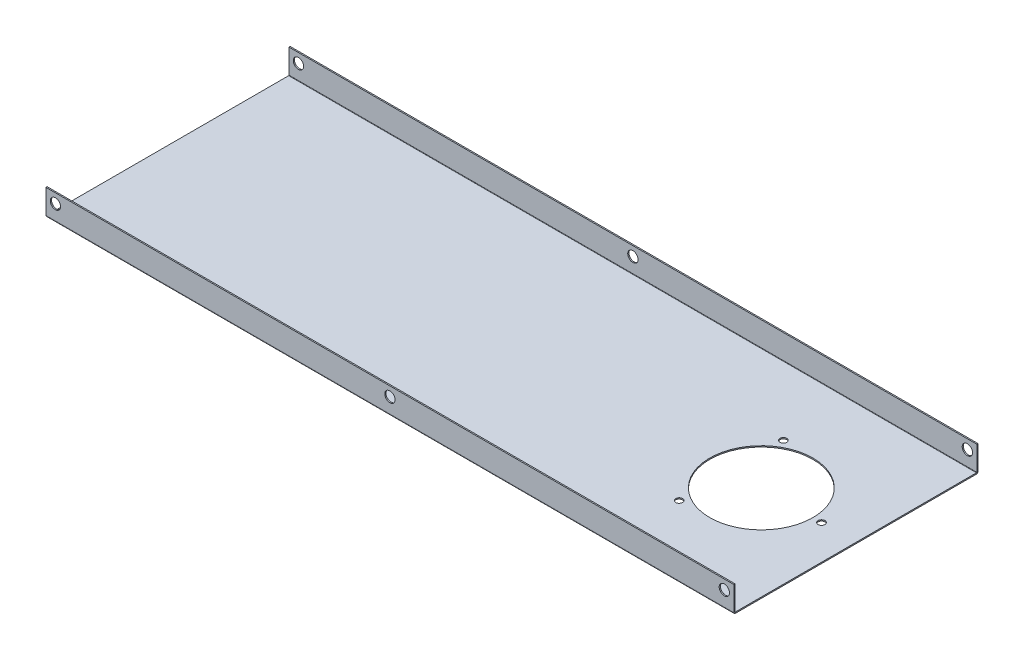
ISO-10303-21;
HEADER;
FILE_DESCRIPTION(('STEP AP214'),'2;1');
FILE_NAME('part.step','',(''),(''),'','','');
FILE_SCHEMA(('AUTOMOTIVE_DESIGN { 1 0 10303 214 1 1 1 1 }'));
ENDSEC;
DATA;
#1=APPLICATION_CONTEXT('core data for automotive mechanical design processes');
#2=APPLICATION_PROTOCOL_DEFINITION('international standard','automotive_design',2000,#1);
#3=PRODUCT_CONTEXT('',#1,'mechanical');
#4=PRODUCT('Part','Part','',(#3));
#5=PRODUCT_RELATED_PRODUCT_CATEGORY('part','',(#4));
#6=PRODUCT_DEFINITION_FORMATION('','',#4);
#7=PRODUCT_DEFINITION_CONTEXT('part definition',#1,'design');
#8=PRODUCT_DEFINITION('design','',#6,#7);
#9=PRODUCT_DEFINITION_SHAPE('','',#8);
#10=(LENGTH_UNIT() NAMED_UNIT(*) SI_UNIT(.MILLI.,.METRE.));
#11=(NAMED_UNIT(*) PLANE_ANGLE_UNIT() SI_UNIT($,.RADIAN.));
#12=(NAMED_UNIT(*) SI_UNIT($,.STERADIAN.) SOLID_ANGLE_UNIT());
#13=UNCERTAINTY_MEASURE_WITH_UNIT(LENGTH_MEASURE(1.E-05),#10,'distance_accuracy_value','');
#14=(GEOMETRIC_REPRESENTATION_CONTEXT(3) GLOBAL_UNCERTAINTY_ASSIGNED_CONTEXT((#13)) GLOBAL_UNIT_ASSIGNED_CONTEXT((#10,
#11,#12)) REPRESENTATION_CONTEXT('',''));
#15=CARTESIAN_POINT('',(0.,0.,0.));
#16=DIRECTION('',(0.,0.,1.));
#17=DIRECTION('',(1.,0.,0.));
#18=AXIS2_PLACEMENT_3D('',#15,#16,#17);
#19=CARTESIAN_POINT('',(0.,-0.7,0.));
#20=DIRECTION('',(0.,-1.,0.));
#21=DIRECTION('',(0.,0.,-1.));
#22=AXIS2_PLACEMENT_3D('',#19,#20,#21);
#23=PLANE('',#22);
#24=CARTESIAN_POINT('',(145.,-0.7,0.));
#25=DIRECTION('',(0.,-1.,0.));
#26=DIRECTION('',(0.,0.,-1.));
#27=AXIS2_PLACEMENT_3D('',#24,#25,#26);
#28=CIRCLE('',#27,30.);
#29=CARTESIAN_POINT('',(145.,-0.7,-30.));
#30=VERTEX_POINT('',#29);
#31=EDGE_CURVE('E535',#30,#30,#28,.T.);
#32=ORIENTED_EDGE('',*,*,#31,.F.);
#33=EDGE_LOOP('',(#32));
#34=FACE_BOUND('',#33,.T.);
#35=CARTESIAN_POINT('',(180.,-0.7,0.));
#36=DIRECTION('',(0.,-1.,0.));
#37=DIRECTION('',(0.,0.,-1.));
#38=AXIS2_PLACEMENT_3D('',#35,#36,#37);
#39=CIRCLE('',#38,2.);
#40=CARTESIAN_POINT('',(180.,-0.7,-2.));
#41=VERTEX_POINT('',#40);
#42=EDGE_CURVE('E532',#41,#41,#39,.T.);
#43=ORIENTED_EDGE('',*,*,#42,.F.);
#44=EDGE_LOOP('',(#43));
#45=FACE_BOUND('',#44,.T.);
#46=CARTESIAN_POINT('',(127.5,-0.7,-30.3108891324554));
#47=DIRECTION('',(0.,-1.,0.));
#48=DIRECTION('',(0.,0.,-1.));
#49=AXIS2_PLACEMENT_3D('',#46,#47,#48);
#50=CIRCLE('',#49,2.);
#51=CARTESIAN_POINT('',(127.5,-0.7,-32.3108891324554));
#52=VERTEX_POINT('',#51);
#53=EDGE_CURVE('E525',#52,#52,#50,.T.);
#54=ORIENTED_EDGE('',*,*,#53,.F.);
#55=EDGE_LOOP('',(#54));
#56=FACE_BOUND('',#55,.T.);
#57=CARTESIAN_POINT('',(127.5,-0.7,30.3108891324553));
#58=DIRECTION('',(0.,-1.,0.));
#59=DIRECTION('',(0.,0.,-1.));
#60=AXIS2_PLACEMENT_3D('',#57,#58,#59);
#61=CIRCLE('',#60,2.);
#62=CARTESIAN_POINT('',(127.5,-0.7,28.3108891324554));
#63=VERTEX_POINT('',#62);
#64=EDGE_CURVE('E314',#63,#63,#61,.T.);
#65=ORIENTED_EDGE('',*,*,#64,.F.);
#66=EDGE_LOOP('',(#65));
#67=FACE_BOUND('',#66,.T.);
#68=DIRECTION('',(0.,0.,-1.));
#69=VECTOR('',#68,1.);
#70=CARTESIAN_POINT('',(200.,-0.7,71.));
#71=LINE('',#70,#69);
#72=CARTESIAN_POINT('',(200.,-0.699999999999993,70.1));
#73=VERTEX_POINT('',#72);
#74=CARTESIAN_POINT('',(200.,-0.7,-70.1));
#75=VERTEX_POINT('',#74);
#76=EDGE_CURVE('E87',#73,#75,#71,.T.);
#77=ORIENTED_EDGE('',*,*,#76,.F.);
#78=DIRECTION('',(1.,0.,0.));
#79=VECTOR('',#78,1.);
#80=CARTESIAN_POINT('',(200.,-0.699999999999993,70.1));
#81=LINE('',#80,#79);
#82=CARTESIAN_POINT('',(-200.,-0.7,70.1));
#83=VERTEX_POINT('',#82);
#84=EDGE_CURVE('E212',#73,#83,#81,.F.);
#85=ORIENTED_EDGE('',*,*,#84,.T.);
#86=DIRECTION('',(0.,0.,1.));
#87=VECTOR('',#86,1.);
#88=CARTESIAN_POINT('',(-200.,-0.7,71.));
#89=LINE('',#88,#87);
#90=CARTESIAN_POINT('',(-200.,-0.700000000000022,-70.1));
#91=VERTEX_POINT('',#90);
#92=EDGE_CURVE('E13',#91,#83,#89,.T.);
#93=ORIENTED_EDGE('',*,*,#92,.F.);
#94=DIRECTION('',(-1.,0.,0.));
#95=VECTOR('',#94,1.);
#96=CARTESIAN_POINT('',(-200.,-0.700000000000022,-70.1));
#97=LINE('',#96,#95);
#98=EDGE_CURVE('E263',#91,#75,#97,.F.);
#99=ORIENTED_EDGE('',*,*,#98,.T.);
#100=EDGE_LOOP('',(#77,#85,#93,#99));
#101=FACE_BOUND('',#100,.T.);
#102=ADVANCED_FACE('F78',(#34,#45,#56,#67,#101),#23,.T.);
#103=CARTESIAN_POINT('',(0.,0.,0.));
#104=DIRECTION('',(0.,-1.,0.));
#105=DIRECTION('',(0.,0.,-1.));
#106=AXIS2_PLACEMENT_3D('',#103,#104,#105);
#107=PLANE('',#106);
#108=CARTESIAN_POINT('',(145.,0.,0.));
#109=DIRECTION('',(0.,-1.,0.));
#110=DIRECTION('',(0.,0.,-1.));
#111=AXIS2_PLACEMENT_3D('',#108,#109,#110);
#112=CIRCLE('',#111,30.);
#113=CARTESIAN_POINT('',(145.,0.,-30.));
#114=VERTEX_POINT('',#113);
#115=EDGE_CURVE('E82',#114,#114,#112,.T.);
#116=ORIENTED_EDGE('',*,*,#115,.T.);
#117=EDGE_LOOP('',(#116));
#118=FACE_BOUND('',#117,.T.);
#119=CARTESIAN_POINT('',(180.,0.,0.));
#120=DIRECTION('',(0.,-1.,0.));
#121=DIRECTION('',(0.,0.,-1.));
#122=AXIS2_PLACEMENT_3D('',#119,#120,#121);
#123=CIRCLE('',#122,2.);
#124=CARTESIAN_POINT('',(180.,0.,-2.));
#125=VERTEX_POINT('',#124);
#126=EDGE_CURVE('E316',#125,#125,#123,.T.);
#127=ORIENTED_EDGE('',*,*,#126,.T.);
#128=EDGE_LOOP('',(#127));
#129=FACE_BOUND('',#128,.T.);
#130=CARTESIAN_POINT('',(127.5,0.,-30.3108891324554));
#131=DIRECTION('',(0.,-1.,0.));
#132=DIRECTION('',(0.,0.,-1.));
#133=AXIS2_PLACEMENT_3D('',#130,#131,#132);
#134=CIRCLE('',#133,2.);
#135=CARTESIAN_POINT('',(127.5,0.,-32.3108891324554));
#136=VERTEX_POINT('',#135);
#137=EDGE_CURVE('E313',#136,#136,#134,.T.);
#138=ORIENTED_EDGE('',*,*,#137,.T.);
#139=EDGE_LOOP('',(#138));
#140=FACE_BOUND('',#139,.T.);
#141=CARTESIAN_POINT('',(127.5,0.,30.3108891324553));
#142=DIRECTION('',(0.,-1.,0.));
#143=DIRECTION('',(0.,0.,-1.));
#144=AXIS2_PLACEMENT_3D('',#141,#142,#143);
#145=CIRCLE('',#144,2.);
#146=CARTESIAN_POINT('',(127.5,0.,28.3108891324554));
#147=VERTEX_POINT('',#146);
#148=EDGE_CURVE('E310',#147,#147,#145,.T.);
#149=ORIENTED_EDGE('',*,*,#148,.T.);
#150=EDGE_LOOP('',(#149));
#151=FACE_BOUND('',#150,.T.);
#152=DIRECTION('',(1.,0.,0.));
#153=VECTOR('',#152,1.);
#154=CARTESIAN_POINT('',(200.,0.,70.1));
#155=LINE('',#154,#153);
#156=CARTESIAN_POINT('',(200.,0.,70.1));
#157=VERTEX_POINT('',#156);
#158=CARTESIAN_POINT('',(-200.,0.,70.1));
#159=VERTEX_POINT('',#158);
#160=EDGE_CURVE('E223',#157,#159,#155,.F.);
#161=ORIENTED_EDGE('',*,*,#160,.F.);
#162=DIRECTION('',(0.,0.,-1.));
#163=VECTOR('',#162,1.);
#164=CARTESIAN_POINT('',(200.,0.,71.));
#165=LINE('',#164,#163);
#166=CARTESIAN_POINT('',(200.,0.,-70.1));
#167=VERTEX_POINT('',#166);
#168=EDGE_CURVE('E280',#157,#167,#165,.T.);
#169=ORIENTED_EDGE('',*,*,#168,.T.);
#170=DIRECTION('',(-1.,0.,0.));
#171=VECTOR('',#170,1.);
#172=CARTESIAN_POINT('',(-200.,0.,-70.1));
#173=LINE('',#172,#171);
#174=CARTESIAN_POINT('',(-200.,0.,-70.1));
#175=VERTEX_POINT('',#174);
#176=EDGE_CURVE('E274',#175,#167,#173,.F.);
#177=ORIENTED_EDGE('',*,*,#176,.F.);
#178=DIRECTION('',(0.,0.,1.));
#179=VECTOR('',#178,1.);
#180=CARTESIAN_POINT('',(-200.,0.,71.));
#181=LINE('',#180,#179);
#182=EDGE_CURVE('E284',#175,#159,#181,.T.);
#183=ORIENTED_EDGE('',*,*,#182,.T.);
#184=EDGE_LOOP('',(#161,#169,#177,#183));
#185=FACE_BOUND('',#184,.T.);
#186=ADVANCED_FACE('F365',(#118,#129,#140,#151,#185),#107,.F.);
#187=CARTESIAN_POINT('',(200.,-0.7,71.));
#188=DIRECTION('',(1.,0.,0.));
#189=DIRECTION('',(0.,0.,-1.));
#190=AXIS2_PLACEMENT_3D('',#187,#188,#189);
#191=PLANE('',#190);
#192=ORIENTED_EDGE('',*,*,#168,.F.);
#193=DIRECTION('',(0.,-1.,0.));
#194=VECTOR('',#193,1.);
#195=CARTESIAN_POINT('',(200.,0.,70.1));
#196=LINE('',#195,#194);
#197=EDGE_CURVE('E217',#157,#73,#196,.T.);
#198=ORIENTED_EDGE('',*,*,#197,.T.);
#199=ORIENTED_EDGE('',*,*,#76,.T.);
#200=DIRECTION('',(0.,-1.,0.));
#201=VECTOR('',#200,1.);
#202=CARTESIAN_POINT('',(200.,0.,-70.1));
#203=LINE('',#202,#201);
#204=EDGE_CURVE('E278',#167,#75,#203,.T.);
#205=ORIENTED_EDGE('',*,*,#204,.F.);
#206=EDGE_LOOP('',(#192,#198,#199,#205));
#207=FACE_BOUND('',#206,.T.);
#208=ADVANCED_FACE('F80',(#207),#191,.T.);
#209=CARTESIAN_POINT('',(-200.,-0.7,71.));
#210=DIRECTION('',(-1.,0.,0.));
#211=DIRECTION('',(0.,0.,1.));
#212=AXIS2_PLACEMENT_3D('',#209,#210,#211);
#213=PLANE('',#212);
#214=DIRECTION('',(0.,-1.,0.));
#215=VECTOR('',#214,1.);
#216=CARTESIAN_POINT('',(-200.,0.,70.1));
#217=LINE('',#216,#215);
#218=EDGE_CURVE('E228',#159,#83,#217,.T.);
#219=ORIENTED_EDGE('',*,*,#218,.F.);
#220=ORIENTED_EDGE('',*,*,#182,.F.);
#221=DIRECTION('',(0.,-1.,0.));
#222=VECTOR('',#221,1.);
#223=CARTESIAN_POINT('',(-200.,0.,-70.1));
#224=LINE('',#223,#222);
#225=EDGE_CURVE('E268',#175,#91,#224,.T.);
#226=ORIENTED_EDGE('',*,*,#225,.T.);
#227=ORIENTED_EDGE('',*,*,#92,.T.);
#228=EDGE_LOOP('',(#219,#220,#226,#227));
#229=FACE_BOUND('',#228,.T.);
#230=ADVANCED_FACE('F377',(#229),#213,.T.);
#231=CARTESIAN_POINT('',(200.,0.200000000000011,-70.1));
#232=DIRECTION('',(1.,0.,0.));
#233=DIRECTION('',(0.,1.,0.));
#234=AXIS2_PLACEMENT_3D('',#231,#232,#233);
#235=PLANE('',#234);
#236=DIRECTION('',(0.,0.,1.));
#237=VECTOR('',#236,1.);
#238=CARTESIAN_POINT('',(200.,0.200000000000011,-71.));
#239=LINE('',#238,#237);
#240=CARTESIAN_POINT('',(200.,0.20000000000001,-70.3));
#241=VERTEX_POINT('',#240);
#242=CARTESIAN_POINT('',(200.,0.200000000000007,-71.));
#243=VERTEX_POINT('',#242);
#244=EDGE_CURVE('E230',#241,#243,#239,.F.);
#245=ORIENTED_EDGE('',*,*,#244,.F.);
#246=CARTESIAN_POINT('',(200.,0.200000000000011,-70.1));
#247=DIRECTION('',(-1.,0.,0.));
#248=DIRECTION('',(0.,-1.,0.));
#249=AXIS2_PLACEMENT_3D('',#246,#247,#248);
#250=CIRCLE('',#249,0.200000000000006);
#251=EDGE_CURVE('E271',#167,#241,#250,.F.);
#252=ORIENTED_EDGE('',*,*,#251,.F.);
#253=ORIENTED_EDGE('',*,*,#204,.T.);
#254=CARTESIAN_POINT('',(200.,0.200000000000011,-70.1));
#255=DIRECTION('',(-1.,0.,0.));
#256=DIRECTION('',(0.,-1.,0.));
#257=AXIS2_PLACEMENT_3D('',#254,#255,#256);
#258=CIRCLE('',#257,0.900000000000006);
#259=EDGE_CURVE('E95',#75,#243,#258,.F.);
#260=ORIENTED_EDGE('',*,*,#259,.T.);
#261=EDGE_LOOP('',(#245,#252,#253,#260));
#262=FACE_BOUND('',#261,.T.);
#263=ADVANCED_FACE('F379',(#262),#235,.T.);
#264=CARTESIAN_POINT('',(-200.,0.199999999999984,-70.1));
#265=DIRECTION('',(1.,0.,0.));
#266=DIRECTION('',(0.,1.,0.));
#267=AXIS2_PLACEMENT_3D('',#264,#265,#266);
#268=PLANE('',#267);
#269=CARTESIAN_POINT('',(-200.,0.199999999999984,-70.1));
#270=DIRECTION('',(-1.,0.,0.));
#271=DIRECTION('',(0.,-1.,0.));
#272=AXIS2_PLACEMENT_3D('',#269,#270,#271);
#273=CIRCLE('',#272,0.200000000000006);
#274=CARTESIAN_POINT('',(-200.,0.199999999999983,-70.3));
#275=VERTEX_POINT('',#274);
#276=EDGE_CURVE('E236',#275,#175,#273,.T.);
#277=ORIENTED_EDGE('',*,*,#276,.F.);
#278=DIRECTION('',(0.,0.,1.));
#279=VECTOR('',#278,1.);
#280=CARTESIAN_POINT('',(-200.,0.199999999999992,-70.3));
#281=LINE('',#280,#279);
#282=CARTESIAN_POINT('',(-200.,0.199999999999997,-71.));
#283=VERTEX_POINT('',#282);
#284=EDGE_CURVE('E256',#275,#283,#281,.F.);
#285=ORIENTED_EDGE('',*,*,#284,.T.);
#286=CARTESIAN_POINT('',(-200.,0.199999999999984,-70.1));
#287=DIRECTION('',(-1.,0.,0.));
#288=DIRECTION('',(0.,-1.,0.));
#289=AXIS2_PLACEMENT_3D('',#286,#287,#288);
#290=CIRCLE('',#289,0.900000000000006);
#291=EDGE_CURVE('E266',#283,#91,#290,.T.);
#292=ORIENTED_EDGE('',*,*,#291,.T.);
#293=ORIENTED_EDGE('',*,*,#225,.F.);
#294=EDGE_LOOP('',(#277,#285,#292,#293));
#295=FACE_BOUND('',#294,.T.);
#296=ADVANCED_FACE('F375',(#295),#268,.F.);
#297=CARTESIAN_POINT('',(-200.,0.199999999999984,-70.1));
#298=DIRECTION('',(-1.,0.,0.));
#299=DIRECTION('',(0.,0.,-1.));
#300=AXIS2_PLACEMENT_3D('',#297,#298,#299);
#301=CYLINDRICAL_SURFACE('',#300,0.900000000000006);
#302=ORIENTED_EDGE('',*,*,#98,.F.);
#303=ORIENTED_EDGE('',*,*,#291,.F.);
#304=DIRECTION('',(-1.,0.,0.));
#305=VECTOR('',#304,1.);
#306=CARTESIAN_POINT('',(200.,0.200000000000011,-71.));
#307=LINE('',#306,#305);
#308=EDGE_CURVE('E254',#283,#243,#307,.F.);
#309=ORIENTED_EDGE('',*,*,#308,.T.);
#310=ORIENTED_EDGE('',*,*,#259,.F.);
#311=EDGE_LOOP('',(#302,#303,#309,#310));
#312=FACE_BOUND('',#311,.T.);
#313=ADVANCED_FACE('F428',(#312),#301,.T.);
#314=CARTESIAN_POINT('',(-200.,0.199999999999984,-70.1));
#315=DIRECTION('',(-1.,0.,0.));
#316=DIRECTION('',(0.,0.,-1.));
#317=AXIS2_PLACEMENT_3D('',#314,#315,#316);
#318=CYLINDRICAL_SURFACE('',#317,0.200000000000006);
#319=ORIENTED_EDGE('',*,*,#176,.T.);
#320=ORIENTED_EDGE('',*,*,#251,.T.);
#321=DIRECTION('',(-1.,0.,0.));
#322=VECTOR('',#321,1.);
#323=CARTESIAN_POINT('',(200.,0.200000000000006,-70.3));
#324=LINE('',#323,#322);
#325=EDGE_CURVE('E259',#241,#275,#324,.T.);
#326=ORIENTED_EDGE('',*,*,#325,.T.);
#327=ORIENTED_EDGE('',*,*,#276,.T.);
#328=EDGE_LOOP('',(#319,#320,#326,#327));
#329=FACE_BOUND('',#328,.T.);
#330=ADVANCED_FACE('F397',(#329),#318,.F.);
#331=CARTESIAN_POINT('',(-200.,14.3,-71.));
#332=DIRECTION('',(1.,0.,0.));
#333=DIRECTION('',(0.,0.,-1.));
#334=AXIS2_PLACEMENT_3D('',#331,#332,#333);
#335=PLANE('',#334);
#336=ORIENTED_EDGE('',*,*,#284,.F.);
#337=DIRECTION('',(0.,-1.,0.));
#338=VECTOR('',#337,1.);
#339=CARTESIAN_POINT('',(-200.,14.3,-70.3));
#340=LINE('',#339,#338);
#341=CARTESIAN_POINT('',(-200.,14.3,-70.3));
#342=VERTEX_POINT('',#341);
#343=EDGE_CURVE('E252',#275,#342,#340,.F.);
#344=ORIENTED_EDGE('',*,*,#343,.T.);
#345=DIRECTION('',(0.,0.,1.));
#346=VECTOR('',#345,1.);
#347=CARTESIAN_POINT('',(-200.,14.3,-71.));
#348=LINE('',#347,#346);
#349=CARTESIAN_POINT('',(-200.,14.3,-71.));
#350=VERTEX_POINT('',#349);
#351=EDGE_CURVE('E233',#350,#342,#348,.T.);
#352=ORIENTED_EDGE('',*,*,#351,.F.);
#353=DIRECTION('',(0.,1.,0.));
#354=VECTOR('',#353,1.);
#355=CARTESIAN_POINT('',(-200.,-2.78058843749729E-13,-71.));
#356=LINE('',#355,#354);
#357=EDGE_CURVE('E245',#283,#350,#356,.T.);
#358=ORIENTED_EDGE('',*,*,#357,.F.);
#359=EDGE_LOOP('',(#336,#344,#352,#358));
#360=FACE_BOUND('',#359,.T.);
#361=ADVANCED_FACE('F420',(#360),#335,.F.);
#362=CARTESIAN_POINT('',(200.,0.,-71.));
#363=DIRECTION('',(-1.,0.,0.));
#364=DIRECTION('',(0.,-1.,0.));
#365=AXIS2_PLACEMENT_3D('',#362,#363,#364);
#366=PLANE('',#365);
#367=ORIENTED_EDGE('',*,*,#244,.T.);
#368=DIRECTION('',(0.,-1.,0.));
#369=VECTOR('',#368,1.);
#370=CARTESIAN_POINT('',(200.,-6.66248712499784E-13,-71.));
#371=LINE('',#370,#369);
#372=CARTESIAN_POINT('',(200.,14.3,-71.));
#373=VERTEX_POINT('',#372);
#374=EDGE_CURVE('E240',#373,#243,#371,.T.);
#375=ORIENTED_EDGE('',*,*,#374,.F.);
#376=DIRECTION('',(0.,0.,1.));
#377=VECTOR('',#376,1.);
#378=CARTESIAN_POINT('',(200.,14.3,-71.));
#379=LINE('',#378,#377);
#380=CARTESIAN_POINT('',(200.,14.3,-70.3));
#381=VERTEX_POINT('',#380);
#382=EDGE_CURVE('E237',#373,#381,#379,.T.);
#383=ORIENTED_EDGE('',*,*,#382,.T.);
#384=DIRECTION('',(0.,1.,0.));
#385=VECTOR('',#384,1.);
#386=CARTESIAN_POINT('',(200.,0.,-70.3));
#387=LINE('',#386,#385);
#388=EDGE_CURVE('E247',#381,#241,#387,.F.);
#389=ORIENTED_EDGE('',*,*,#388,.T.);
#390=EDGE_LOOP('',(#367,#375,#383,#389));
#391=FACE_BOUND('',#390,.T.);
#392=ADVANCED_FACE('F402',(#391),#366,.F.);
#393=CARTESIAN_POINT('',(0.,-2.78058843749729E-13,-71.));
#394=DIRECTION('',(0.,0.,1.));
#395=DIRECTION('',(0.,-1.,0.));
#396=AXIS2_PLACEMENT_3D('',#393,#394,#395);
#397=PLANE('',#396);
#398=CARTESIAN_POINT('',(194.5,8.8,-71.));
#399=DIRECTION('',(0.,0.,-1.));
#400=DIRECTION('',(0.,1.,0.));
#401=AXIS2_PLACEMENT_3D('',#398,#399,#400);
#402=CIRCLE('',#401,2.99999999999999);
#403=CARTESIAN_POINT('',(194.5,11.8,-71.));
#404=VERTEX_POINT('',#403);
#405=EDGE_CURVE('E294',#404,#404,#402,.T.);
#406=ORIENTED_EDGE('',*,*,#405,.F.);
#407=EDGE_LOOP('',(#406));
#408=FACE_BOUND('',#407,.T.);
#409=CARTESIAN_POINT('',(0.,8.80000000000001,-71.));
#410=DIRECTION('',(0.,0.,-1.));
#411=DIRECTION('',(0.,1.,0.));
#412=AXIS2_PLACEMENT_3D('',#409,#410,#411);
#413=CIRCLE('',#412,3.);
#414=CARTESIAN_POINT('',(0.,11.8,-71.));
#415=VERTEX_POINT('',#414);
#416=EDGE_CURVE('E335',#415,#415,#413,.T.);
#417=ORIENTED_EDGE('',*,*,#416,.F.);
#418=EDGE_LOOP('',(#417));
#419=FACE_BOUND('',#418,.T.);
#420=CARTESIAN_POINT('',(-194.5,8.80000000000005,-71.));
#421=DIRECTION('',(0.,0.,-1.));
#422=DIRECTION('',(0.,-1.,0.));
#423=AXIS2_PLACEMENT_3D('',#420,#421,#422);
#424=CIRCLE('',#423,2.99999999999999);
#425=CARTESIAN_POINT('',(-194.5,5.80000000000005,-71.));
#426=VERTEX_POINT('',#425);
#427=EDGE_CURVE('E309',#426,#426,#424,.T.);
#428=ORIENTED_EDGE('',*,*,#427,.F.);
#429=EDGE_LOOP('',(#428));
#430=FACE_BOUND('',#429,.T.);
#431=ORIENTED_EDGE('',*,*,#308,.F.);
#432=ORIENTED_EDGE('',*,*,#357,.T.);
#433=DIRECTION('',(1.,0.,0.));
#434=VECTOR('',#433,1.);
#435=CARTESIAN_POINT('',(0.,14.3,-71.));
#436=LINE('',#435,#434);
#437=EDGE_CURVE('E243',#350,#373,#436,.T.);
#438=ORIENTED_EDGE('',*,*,#437,.T.);
#439=ORIENTED_EDGE('',*,*,#374,.T.);
#440=EDGE_LOOP('',(#431,#432,#438,#439));
#441=FACE_BOUND('',#440,.T.);
#442=ADVANCED_FACE('F406',(#408,#419,#430,#441),#397,.F.);
#443=CARTESIAN_POINT('',(0.,-2.75614806812539E-13,-70.3));
#444=DIRECTION('',(0.,0.,1.));
#445=DIRECTION('',(0.,-1.,0.));
#446=AXIS2_PLACEMENT_3D('',#443,#444,#445);
#447=PLANE('',#446);
#448=CARTESIAN_POINT('',(194.5,8.8,-70.3));
#449=DIRECTION('',(0.,0.,1.));
#450=DIRECTION('',(0.,-1.,0.));
#451=AXIS2_PLACEMENT_3D('',#448,#449,#450);
#452=CIRCLE('',#451,2.99999999999999);
#453=CARTESIAN_POINT('',(194.5,5.80000000000001,-70.3));
#454=VERTEX_POINT('',#453);
#455=EDGE_CURVE('E211',#454,#454,#452,.T.);
#456=ORIENTED_EDGE('',*,*,#455,.F.);
#457=EDGE_LOOP('',(#456));
#458=FACE_BOUND('',#457,.T.);
#459=CARTESIAN_POINT('',(0.,8.80000000000001,-70.3));
#460=DIRECTION('',(0.,0.,1.));
#461=DIRECTION('',(0.,-1.,0.));
#462=AXIS2_PLACEMENT_3D('',#459,#460,#461);
#463=CIRCLE('',#462,3.);
#464=CARTESIAN_POINT('',(0.,5.80000000000001,-70.3));
#465=VERTEX_POINT('',#464);
#466=EDGE_CURVE('E293',#465,#465,#463,.T.);
#467=ORIENTED_EDGE('',*,*,#466,.F.);
#468=EDGE_LOOP('',(#467));
#469=FACE_BOUND('',#468,.T.);
#470=CARTESIAN_POINT('',(-194.5,8.80000000000005,-70.3));
#471=DIRECTION('',(0.,0.,1.));
#472=DIRECTION('',(0.,-1.,0.));
#473=AXIS2_PLACEMENT_3D('',#470,#471,#472);
#474=CIRCLE('',#473,2.99999999999999);
#475=CARTESIAN_POINT('',(-194.5,5.80000000000005,-70.3));
#476=VERTEX_POINT('',#475);
#477=EDGE_CURVE('E290',#476,#476,#474,.T.);
#478=ORIENTED_EDGE('',*,*,#477,.F.);
#479=EDGE_LOOP('',(#478));
#480=FACE_BOUND('',#479,.T.);
#481=ORIENTED_EDGE('',*,*,#343,.F.);
#482=ORIENTED_EDGE('',*,*,#325,.F.);
#483=ORIENTED_EDGE('',*,*,#388,.F.);
#484=DIRECTION('',(-1.,0.,0.));
#485=VECTOR('',#484,1.);
#486=CARTESIAN_POINT('',(200.,14.3,-70.3));
#487=LINE('',#486,#485);
#488=EDGE_CURVE('E250',#342,#381,#487,.F.);
#489=ORIENTED_EDGE('',*,*,#488,.F.);
#490=EDGE_LOOP('',(#481,#482,#483,#489));
#491=FACE_BOUND('',#490,.T.);
#492=ADVANCED_FACE('F416',(#458,#469,#480,#491),#447,.T.);
#493=CARTESIAN_POINT('',(200.,14.3,-71.));
#494=DIRECTION('',(0.,-1.,0.));
#495=DIRECTION('',(0.,0.,-1.));
#496=AXIS2_PLACEMENT_3D('',#493,#494,#495);
#497=PLANE('',#496);
#498=ORIENTED_EDGE('',*,*,#488,.T.);
#499=ORIENTED_EDGE('',*,*,#382,.F.);
#500=ORIENTED_EDGE('',*,*,#437,.F.);
#501=ORIENTED_EDGE('',*,*,#351,.T.);
#502=EDGE_LOOP('',(#498,#499,#500,#501));
#503=FACE_BOUND('',#502,.T.);
#504=ADVANCED_FACE('F412',(#503),#497,.F.);
#505=CARTESIAN_POINT('',(-200.,0.200000000000013,70.1));
#506=DIRECTION('',(-1.,0.,0.));
#507=DIRECTION('',(0.,0.,1.));
#508=AXIS2_PLACEMENT_3D('',#505,#506,#507);
#509=PLANE('',#508);
#510=DIRECTION('',(0.,0.,-1.));
#511=VECTOR('',#510,1.);
#512=CARTESIAN_POINT('',(-200.,0.200000000000006,71.));
#513=LINE('',#512,#511);
#514=CARTESIAN_POINT('',(-200.,0.200000000000013,70.3));
#515=VERTEX_POINT('',#514);
#516=CARTESIAN_POINT('',(-200.,0.200000000000013,71.));
#517=VERTEX_POINT('',#516);
#518=EDGE_CURVE('E193',#515,#517,#513,.F.);
#519=ORIENTED_EDGE('',*,*,#518,.F.);
#520=CARTESIAN_POINT('',(-200.,0.200000000000013,70.1));
#521=DIRECTION('',(1.,0.,0.));
#522=DIRECTION('',(0.,0.,-1.));
#523=AXIS2_PLACEMENT_3D('',#520,#521,#522);
#524=CIRCLE('',#523,0.200000000000006);
#525=EDGE_CURVE('E220',#159,#515,#524,.F.);
#526=ORIENTED_EDGE('',*,*,#525,.F.);
#527=ORIENTED_EDGE('',*,*,#218,.T.);
#528=CARTESIAN_POINT('',(-200.,0.200000000000013,70.1));
#529=DIRECTION('',(1.,0.,0.));
#530=DIRECTION('',(0.,0.,-1.));
#531=AXIS2_PLACEMENT_3D('',#528,#529,#530);
#532=CIRCLE('',#531,0.900000000000006);
#533=EDGE_CURVE('E103',#83,#517,#532,.F.);
#534=ORIENTED_EDGE('',*,*,#533,.T.);
#535=EDGE_LOOP('',(#519,#526,#527,#534));
#536=FACE_BOUND('',#535,.T.);
#537=ADVANCED_FACE('F438',(#536),#509,.T.);
#538=CARTESIAN_POINT('',(200.,0.200000000000013,70.1));
#539=DIRECTION('',(-1.,0.,0.));
#540=DIRECTION('',(0.,0.,1.));
#541=AXIS2_PLACEMENT_3D('',#538,#539,#540);
#542=PLANE('',#541);
#543=CARTESIAN_POINT('',(200.,0.200000000000013,70.1));
#544=DIRECTION('',(1.,0.,0.));
#545=DIRECTION('',(0.,0.,-1.));
#546=AXIS2_PLACEMENT_3D('',#543,#544,#545);
#547=CIRCLE('',#546,0.200000000000006);
#548=CARTESIAN_POINT('',(200.,0.200000000000013,70.3));
#549=VERTEX_POINT('',#548);
#550=EDGE_CURVE('E225',#549,#157,#547,.T.);
#551=ORIENTED_EDGE('',*,*,#550,.F.);
#552=DIRECTION('',(0.,0.,-1.));
#553=VECTOR('',#552,1.);
#554=CARTESIAN_POINT('',(200.,0.20000000000002,70.3));
#555=LINE('',#554,#553);
#556=CARTESIAN_POINT('',(200.,0.20000000000002,71.));
#557=VERTEX_POINT('',#556);
#558=EDGE_CURVE('E205',#549,#557,#555,.F.);
#559=ORIENTED_EDGE('',*,*,#558,.T.);
#560=CARTESIAN_POINT('',(200.,0.200000000000013,70.1));
#561=DIRECTION('',(1.,0.,0.));
#562=DIRECTION('',(0.,0.,-1.));
#563=AXIS2_PLACEMENT_3D('',#560,#561,#562);
#564=CIRCLE('',#563,0.900000000000006);
#565=EDGE_CURVE('E215',#557,#73,#564,.T.);
#566=ORIENTED_EDGE('',*,*,#565,.T.);
#567=ORIENTED_EDGE('',*,*,#197,.F.);
#568=EDGE_LOOP('',(#551,#559,#566,#567));
#569=FACE_BOUND('',#568,.T.);
#570=ADVANCED_FACE('F351',(#569),#542,.F.);
#571=CARTESIAN_POINT('',(200.,0.200000000000013,70.1));
#572=DIRECTION('',(1.,0.,0.));
#573=DIRECTION('',(0.,0.,1.));
#574=AXIS2_PLACEMENT_3D('',#571,#572,#573);
#575=CYLINDRICAL_SURFACE('',#574,0.900000000000006);
#576=ORIENTED_EDGE('',*,*,#84,.F.);
#577=ORIENTED_EDGE('',*,*,#565,.F.);
#578=DIRECTION('',(1.,0.,0.));
#579=VECTOR('',#578,1.);
#580=CARTESIAN_POINT('',(-200.,0.200000000000006,71.));
#581=LINE('',#580,#579);
#582=EDGE_CURVE('E203',#557,#517,#581,.F.);
#583=ORIENTED_EDGE('',*,*,#582,.T.);
#584=ORIENTED_EDGE('',*,*,#533,.F.);
#585=EDGE_LOOP('',(#576,#577,#583,#584));
#586=FACE_BOUND('',#585,.T.);
#587=ADVANCED_FACE('F360',(#586),#575,.T.);
#588=CARTESIAN_POINT('',(200.,0.200000000000013,70.1));
#589=DIRECTION('',(1.,0.,0.));
#590=DIRECTION('',(0.,0.,1.));
#591=AXIS2_PLACEMENT_3D('',#588,#589,#590);
#592=CYLINDRICAL_SURFACE('',#591,0.200000000000006);
#593=ORIENTED_EDGE('',*,*,#160,.T.);
#594=ORIENTED_EDGE('',*,*,#525,.T.);
#595=DIRECTION('',(1.,0.,0.));
#596=VECTOR('',#595,1.);
#597=CARTESIAN_POINT('',(-200.,0.200000000000006,70.3));
#598=LINE('',#597,#596);
#599=EDGE_CURVE('E208',#515,#549,#598,.T.);
#600=ORIENTED_EDGE('',*,*,#599,.T.);
#601=ORIENTED_EDGE('',*,*,#550,.T.);
#602=EDGE_LOOP('',(#593,#594,#600,#601));
#603=FACE_BOUND('',#602,.T.);
#604=ADVANCED_FACE('F346',(#603),#592,.F.);
#605=CARTESIAN_POINT('',(200.,14.3,71.));
#606=DIRECTION('',(-1.,0.,0.));
#607=DIRECTION('',(0.,-1.,0.));
#608=AXIS2_PLACEMENT_3D('',#605,#606,#607);
#609=PLANE('',#608);
#610=ORIENTED_EDGE('',*,*,#558,.F.);
#611=DIRECTION('',(0.,-1.,0.));
#612=VECTOR('',#611,1.);
#613=CARTESIAN_POINT('',(200.,14.3,70.3));
#614=LINE('',#613,#612);
#615=CARTESIAN_POINT('',(200.,14.3,70.3));
#616=VERTEX_POINT('',#615);
#617=EDGE_CURVE('E201',#549,#616,#614,.F.);
#618=ORIENTED_EDGE('',*,*,#617,.T.);
#619=DIRECTION('',(0.,0.,-1.));
#620=VECTOR('',#619,1.);
#621=CARTESIAN_POINT('',(200.,14.3,71.));
#622=LINE('',#621,#620);
#623=CARTESIAN_POINT('',(200.,14.3,71.));
#624=VERTEX_POINT('',#623);
#625=EDGE_CURVE('E189',#624,#616,#622,.T.);
#626=ORIENTED_EDGE('',*,*,#625,.F.);
#627=DIRECTION('',(0.,1.,0.));
#628=VECTOR('',#627,1.);
#629=CARTESIAN_POINT('',(200.,-3.88189868750055E-13,71.));
#630=LINE('',#629,#628);
#631=EDGE_CURVE('E176',#557,#624,#630,.T.);
#632=ORIENTED_EDGE('',*,*,#631,.F.);
#633=EDGE_LOOP('',(#610,#618,#626,#632));
#634=FACE_BOUND('',#633,.T.);
#635=ADVANCED_FACE('F352',(#634),#609,.F.);
#636=CARTESIAN_POINT('',(-200.,0.,71.));
#637=DIRECTION('',(1.,0.,0.));
#638=DIRECTION('',(0.,0.,-1.));
#639=AXIS2_PLACEMENT_3D('',#636,#637,#638);
#640=PLANE('',#639);
#641=ORIENTED_EDGE('',*,*,#518,.T.);
#642=DIRECTION('',(0.,-1.,0.));
#643=VECTOR('',#642,1.);
#644=CARTESIAN_POINT('',(-200.,0.,71.));
#645=LINE('',#644,#643);
#646=CARTESIAN_POINT('',(-200.,14.3,71.));
#647=VERTEX_POINT('',#646);
#648=EDGE_CURVE('E174',#647,#517,#645,.T.);
#649=ORIENTED_EDGE('',*,*,#648,.F.);
#650=DIRECTION('',(0.,0.,-1.));
#651=VECTOR('',#650,1.);
#652=CARTESIAN_POINT('',(-200.,14.3,71.));
#653=LINE('',#652,#651);
#654=CARTESIAN_POINT('',(-200.,14.3,70.3));
#655=VERTEX_POINT('',#654);
#656=EDGE_CURVE('E182',#647,#655,#653,.T.);
#657=ORIENTED_EDGE('',*,*,#656,.T.);
#658=DIRECTION('',(0.,1.,0.));
#659=VECTOR('',#658,1.);
#660=CARTESIAN_POINT('',(-200.,0.,70.3));
#661=LINE('',#660,#659);
#662=EDGE_CURVE('E198',#655,#515,#661,.F.);
#663=ORIENTED_EDGE('',*,*,#662,.T.);
#664=EDGE_LOOP('',(#641,#649,#657,#663));
#665=FACE_BOUND('',#664,.T.);
#666=ADVANCED_FACE('F192',(#665),#640,.F.);
#667=CARTESIAN_POINT('',(0.,0.,71.));
#668=DIRECTION('',(0.,0.,-1.));
#669=DIRECTION('',(-1.,0.,0.));
#670=AXIS2_PLACEMENT_3D('',#667,#668,#669);
#671=PLANE('',#670);
#672=CARTESIAN_POINT('',(-194.5,8.8,71.));
#673=DIRECTION('',(0.,0.,1.));
#674=DIRECTION('',(1.,0.,0.));
#675=AXIS2_PLACEMENT_3D('',#672,#673,#674);
#676=CIRCLE('',#675,2.99999999999999);
#677=CARTESIAN_POINT('',(-191.5,8.8,71.));
#678=VERTEX_POINT('',#677);
#679=EDGE_CURVE('E303',#678,#678,#676,.T.);
#680=ORIENTED_EDGE('',*,*,#679,.F.);
#681=EDGE_LOOP('',(#680));
#682=FACE_BOUND('',#681,.T.);
#683=CARTESIAN_POINT('',(0.,8.80000000000001,71.));
#684=DIRECTION('',(0.,0.,1.));
#685=DIRECTION('',(1.,0.,0.));
#686=AXIS2_PLACEMENT_3D('',#683,#684,#685);
#687=CIRCLE('',#686,3.);
#688=CARTESIAN_POINT('',(3.,8.80000000000001,71.));
#689=VERTEX_POINT('',#688);
#690=EDGE_CURVE('E325',#689,#689,#687,.T.);
#691=ORIENTED_EDGE('',*,*,#690,.F.);
#692=EDGE_LOOP('',(#691));
#693=FACE_BOUND('',#692,.T.);
#694=CARTESIAN_POINT('',(194.5,8.80000000000005,71.));
#695=DIRECTION('',(0.,0.,1.));
#696=DIRECTION('',(-1.,0.,0.));
#697=AXIS2_PLACEMENT_3D('',#694,#695,#696);
#698=CIRCLE('',#697,2.99999999999999);
#699=CARTESIAN_POINT('',(191.5,8.80000000000005,71.));
#700=VERTEX_POINT('',#699);
#701=EDGE_CURVE('E321',#700,#700,#698,.T.);
#702=ORIENTED_EDGE('',*,*,#701,.F.);
#703=EDGE_LOOP('',(#702));
#704=FACE_BOUND('',#703,.T.);
#705=ORIENTED_EDGE('',*,*,#582,.F.);
#706=ORIENTED_EDGE('',*,*,#631,.T.);
#707=DIRECTION('',(-1.,0.,0.));
#708=VECTOR('',#707,1.);
#709=CARTESIAN_POINT('',(0.,14.3,71.));
#710=LINE('',#709,#708);
#711=EDGE_CURVE('E169',#624,#647,#710,.T.);
#712=ORIENTED_EDGE('',*,*,#711,.T.);
#713=ORIENTED_EDGE('',*,*,#648,.T.);
#714=EDGE_LOOP('',(#705,#706,#712,#713));
#715=FACE_BOUND('',#714,.T.);
#716=ADVANCED_FACE('F172',(#682,#693,#704,#715),#671,.F.);
#717=CARTESIAN_POINT('',(0.,0.,70.3));
#718=DIRECTION('',(0.,0.,-1.));
#719=DIRECTION('',(-1.,0.,0.));
#720=AXIS2_PLACEMENT_3D('',#717,#718,#719);
#721=PLANE('',#720);
#722=CARTESIAN_POINT('',(-194.5,8.8,70.3));
#723=DIRECTION('',(0.,0.,-1.));
#724=DIRECTION('',(-1.,0.,0.));
#725=AXIS2_PLACEMENT_3D('',#722,#723,#724);
#726=CIRCLE('',#725,2.99999999999999);
#727=CARTESIAN_POINT('',(-197.5,8.8,70.3));
#728=VERTEX_POINT('',#727);
#729=EDGE_CURVE('E306',#728,#728,#726,.T.);
#730=ORIENTED_EDGE('',*,*,#729,.F.);
#731=EDGE_LOOP('',(#730));
#732=FACE_BOUND('',#731,.T.);
#733=CARTESIAN_POINT('',(0.,8.80000000000001,70.3));
#734=DIRECTION('',(0.,0.,-1.));
#735=DIRECTION('',(-1.,0.,0.));
#736=AXIS2_PLACEMENT_3D('',#733,#734,#735);
#737=CIRCLE('',#736,3.);
#738=CARTESIAN_POINT('',(-3.,8.80000000000001,70.3));
#739=VERTEX_POINT('',#738);
#740=EDGE_CURVE('E302',#739,#739,#737,.T.);
#741=ORIENTED_EDGE('',*,*,#740,.F.);
#742=EDGE_LOOP('',(#741));
#743=FACE_BOUND('',#742,.T.);
#744=CARTESIAN_POINT('',(194.5,8.80000000000005,70.3));
#745=DIRECTION('',(0.,0.,-1.));
#746=DIRECTION('',(-1.,0.,0.));
#747=AXIS2_PLACEMENT_3D('',#744,#745,#746);
#748=CIRCLE('',#747,2.99999999999999);
#749=CARTESIAN_POINT('',(191.5,8.80000000000005,70.3));
#750=VERTEX_POINT('',#749);
#751=EDGE_CURVE('E299',#750,#750,#748,.T.);
#752=ORIENTED_EDGE('',*,*,#751,.F.);
#753=EDGE_LOOP('',(#752));
#754=FACE_BOUND('',#753,.T.);
#755=ORIENTED_EDGE('',*,*,#617,.F.);
#756=ORIENTED_EDGE('',*,*,#599,.F.);
#757=ORIENTED_EDGE('',*,*,#662,.F.);
#758=DIRECTION('',(1.,0.,0.));
#759=VECTOR('',#758,1.);
#760=CARTESIAN_POINT('',(-200.,14.3,70.3));
#761=LINE('',#760,#759);
#762=EDGE_CURVE('E185',#616,#655,#761,.F.);
#763=ORIENTED_EDGE('',*,*,#762,.F.);
#764=EDGE_LOOP('',(#755,#756,#757,#763));
#765=FACE_BOUND('',#764,.T.);
#766=ADVANCED_FACE('F342',(#732,#743,#754,#765),#721,.T.);
#767=CARTESIAN_POINT('',(-200.,14.3,71.));
#768=DIRECTION('',(0.,-1.,0.));
#769=DIRECTION('',(0.,0.,-1.));
#770=AXIS2_PLACEMENT_3D('',#767,#768,#769);
#771=PLANE('',#770);
#772=ORIENTED_EDGE('',*,*,#762,.T.);
#773=ORIENTED_EDGE('',*,*,#656,.F.);
#774=ORIENTED_EDGE('',*,*,#711,.F.);
#775=ORIENTED_EDGE('',*,*,#625,.T.);
#776=EDGE_LOOP('',(#772,#773,#774,#775));
#777=FACE_BOUND('',#776,.T.);
#778=ADVANCED_FACE('F183',(#777),#771,.F.);
#779=CARTESIAN_POINT('',(-194.5,8.80000000000008,-61.));
#780=DIRECTION('',(0.,0.,-1.));
#781=DIRECTION('',(0.,1.,0.));
#782=AXIS2_PLACEMENT_3D('',#779,#780,#781);
#783=CYLINDRICAL_SURFACE('',#782,2.99999999999999);
#784=ORIENTED_EDGE('',*,*,#477,.T.);
#785=EDGE_LOOP('',(#784));
#786=FACE_BOUND('',#785,.T.);
#787=ORIENTED_EDGE('',*,*,#427,.T.);
#788=EDGE_LOOP('',(#787));
#789=FACE_BOUND('',#788,.T.);
#790=ADVANCED_FACE('F460',(#786,#789),#783,.F.);
#791=CARTESIAN_POINT('',(0.,8.80000000000005,-61.));
#792=DIRECTION('',(0.,0.,-1.));
#793=DIRECTION('',(0.,1.,0.));
#794=AXIS2_PLACEMENT_3D('',#791,#792,#793);
#795=CYLINDRICAL_SURFACE('',#794,3.);
#796=ORIENTED_EDGE('',*,*,#466,.T.);
#797=EDGE_LOOP('',(#796));
#798=FACE_BOUND('',#797,.T.);
#799=ORIENTED_EDGE('',*,*,#416,.T.);
#800=EDGE_LOOP('',(#799));
#801=FACE_BOUND('',#800,.T.);
#802=ADVANCED_FACE('F463',(#798,#801),#795,.F.);
#803=CARTESIAN_POINT('',(194.5,8.80000000000004,-61.));
#804=DIRECTION('',(0.,0.,-1.));
#805=DIRECTION('',(0.,1.,0.));
#806=AXIS2_PLACEMENT_3D('',#803,#804,#805);
#807=CYLINDRICAL_SURFACE('',#806,2.99999999999999);
#808=ORIENTED_EDGE('',*,*,#455,.T.);
#809=EDGE_LOOP('',(#808));
#810=FACE_BOUND('',#809,.T.);
#811=ORIENTED_EDGE('',*,*,#405,.T.);
#812=EDGE_LOOP('',(#811));
#813=FACE_BOUND('',#812,.T.);
#814=ADVANCED_FACE('F471',(#810,#813),#807,.F.);
#815=CARTESIAN_POINT('',(194.5,8.80000000000005,61.));
#816=DIRECTION('',(0.,0.,1.));
#817=DIRECTION('',(1.,0.,0.));
#818=AXIS2_PLACEMENT_3D('',#815,#816,#817);
#819=CYLINDRICAL_SURFACE('',#818,2.99999999999999);
#820=ORIENTED_EDGE('',*,*,#751,.T.);
#821=EDGE_LOOP('',(#820));
#822=FACE_BOUND('',#821,.T.);
#823=ORIENTED_EDGE('',*,*,#701,.T.);
#824=EDGE_LOOP('',(#823));
#825=FACE_BOUND('',#824,.T.);
#826=ADVANCED_FACE('F489',(#822,#825),#819,.F.);
#827=CARTESIAN_POINT('',(0.,8.80000000000001,61.));
#828=DIRECTION('',(0.,0.,1.));
#829=DIRECTION('',(1.,0.,0.));
#830=AXIS2_PLACEMENT_3D('',#827,#828,#829);
#831=CYLINDRICAL_SURFACE('',#830,3.);
#832=ORIENTED_EDGE('',*,*,#740,.T.);
#833=EDGE_LOOP('',(#832));
#834=FACE_BOUND('',#833,.T.);
#835=ORIENTED_EDGE('',*,*,#690,.T.);
#836=EDGE_LOOP('',(#835));
#837=FACE_BOUND('',#836,.T.);
#838=ADVANCED_FACE('F491',(#834,#837),#831,.F.);
#839=CARTESIAN_POINT('',(-194.5,8.8,61.));
#840=DIRECTION('',(0.,0.,1.));
#841=DIRECTION('',(1.,0.,0.));
#842=AXIS2_PLACEMENT_3D('',#839,#840,#841);
#843=CYLINDRICAL_SURFACE('',#842,2.99999999999999);
#844=ORIENTED_EDGE('',*,*,#729,.T.);
#845=EDGE_LOOP('',(#844));
#846=FACE_BOUND('',#845,.T.);
#847=ORIENTED_EDGE('',*,*,#679,.T.);
#848=EDGE_LOOP('',(#847));
#849=FACE_BOUND('',#848,.T.);
#850=ADVANCED_FACE('F497',(#846,#849),#843,.F.);
#851=CARTESIAN_POINT('',(127.5,9.3,30.3108891324553));
#852=DIRECTION('',(0.,-1.,0.));
#853=DIRECTION('',(0.,0.,-1.));
#854=AXIS2_PLACEMENT_3D('',#851,#852,#853);
#855=CYLINDRICAL_SURFACE('',#854,2.);
#856=ORIENTED_EDGE('',*,*,#64,.T.);
#857=EDGE_LOOP('',(#856));
#858=FACE_BOUND('',#857,.T.);
#859=ORIENTED_EDGE('',*,*,#148,.F.);
#860=EDGE_LOOP('',(#859));
#861=FACE_BOUND('',#860,.T.);
#862=ADVANCED_FACE('F504',(#858,#861),#855,.F.);
#863=CARTESIAN_POINT('',(127.5,9.3,-30.3108891324554));
#864=DIRECTION('',(0.,-1.,0.));
#865=DIRECTION('',(0.,0.,-1.));
#866=AXIS2_PLACEMENT_3D('',#863,#864,#865);
#867=CYLINDRICAL_SURFACE('',#866,2.);
#868=ORIENTED_EDGE('',*,*,#53,.T.);
#869=EDGE_LOOP('',(#868));
#870=FACE_BOUND('',#869,.T.);
#871=ORIENTED_EDGE('',*,*,#137,.F.);
#872=EDGE_LOOP('',(#871));
#873=FACE_BOUND('',#872,.T.);
#874=ADVANCED_FACE('F508',(#870,#873),#867,.F.);
#875=CARTESIAN_POINT('',(180.,9.3,0.));
#876=DIRECTION('',(0.,-1.,0.));
#877=DIRECTION('',(0.,0.,-1.));
#878=AXIS2_PLACEMENT_3D('',#875,#876,#877);
#879=CYLINDRICAL_SURFACE('',#878,2.);
#880=ORIENTED_EDGE('',*,*,#42,.T.);
#881=EDGE_LOOP('',(#880));
#882=FACE_BOUND('',#881,.T.);
#883=ORIENTED_EDGE('',*,*,#126,.F.);
#884=EDGE_LOOP('',(#883));
#885=FACE_BOUND('',#884,.T.);
#886=ADVANCED_FACE('F510',(#882,#885),#879,.F.);
#887=CARTESIAN_POINT('',(145.,9.3,0.));
#888=DIRECTION('',(0.,-1.,0.));
#889=DIRECTION('',(0.,0.,-1.));
#890=AXIS2_PLACEMENT_3D('',#887,#888,#889);
#891=CYLINDRICAL_SURFACE('',#890,30.);
#892=ORIENTED_EDGE('',*,*,#31,.T.);
#893=EDGE_LOOP('',(#892));
#894=FACE_BOUND('',#893,.T.);
#895=ORIENTED_EDGE('',*,*,#115,.F.);
#896=EDGE_LOOP('',(#895));
#897=FACE_BOUND('',#896,.T.);
#898=ADVANCED_FACE('F513',(#894,#897),#891,.F.);
#899=CLOSED_SHELL('',(#102,#186,#208,#230,#263,#296,#313,#330,#361,#392,#442,#492,#504,#537,
#570,#587,#604,#635,#666,#716,#766,#778,#790,#802,#814,#826,#838,#850,#862,#874,#886,#898));
#900=MANIFOLD_SOLID_BREP('B2',#899);
#901=ADVANCED_BREP_SHAPE_REPRESENTATION('',(#18,#900),#14);
#902=SHAPE_DEFINITION_REPRESENTATION(#9,#901);
ENDSEC;
END-ISO-10303-21;
